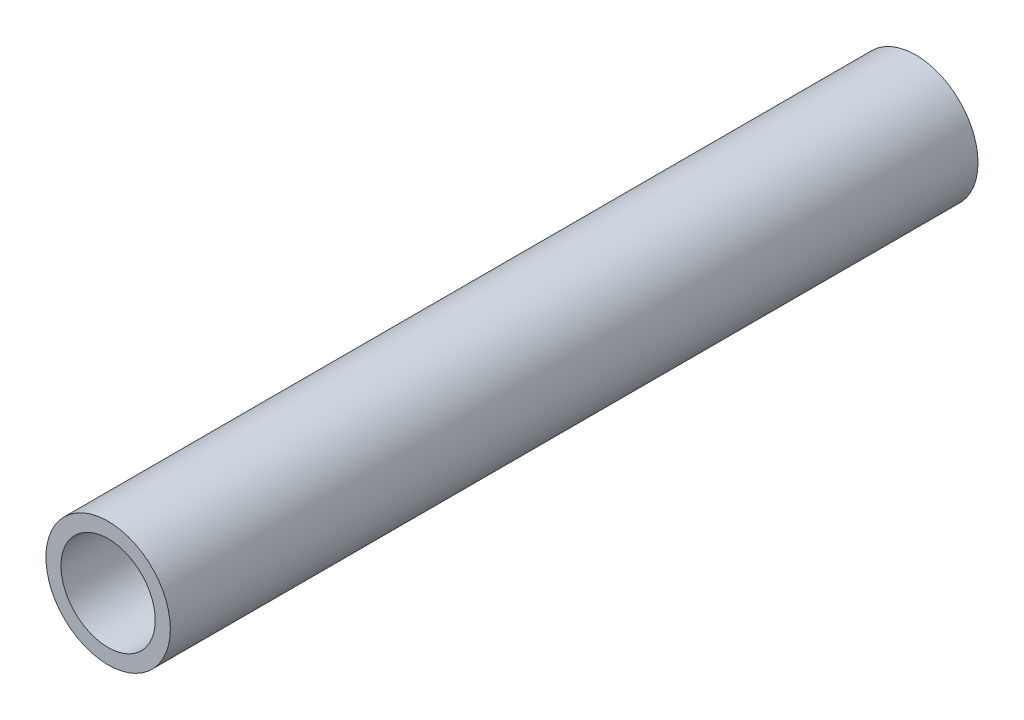
ISO-10303-21;
HEADER;
FILE_DESCRIPTION(('STEP AP214'),'2;1');
FILE_NAME('part.step','',(''),(''),'','','');
FILE_SCHEMA(('AUTOMOTIVE_DESIGN { 1 0 10303 214 1 1 1 1 }'));
ENDSEC;
DATA;
#1=APPLICATION_CONTEXT('core data for automotive mechanical design processes');
#2=APPLICATION_PROTOCOL_DEFINITION('international standard','automotive_design',2000,#1);
#3=PRODUCT_CONTEXT('',#1,'mechanical');
#4=PRODUCT('Part','Part','',(#3));
#5=PRODUCT_RELATED_PRODUCT_CATEGORY('part','',(#4));
#6=PRODUCT_DEFINITION_FORMATION('','',#4);
#7=PRODUCT_DEFINITION_CONTEXT('part definition',#1,'design');
#8=PRODUCT_DEFINITION('design','',#6,#7);
#9=PRODUCT_DEFINITION_SHAPE('','',#8);
#10=(LENGTH_UNIT() NAMED_UNIT(*) SI_UNIT(.MILLI.,.METRE.));
#11=(NAMED_UNIT(*) PLANE_ANGLE_UNIT() SI_UNIT($,.RADIAN.));
#12=(NAMED_UNIT(*) SI_UNIT($,.STERADIAN.) SOLID_ANGLE_UNIT());
#13=UNCERTAINTY_MEASURE_WITH_UNIT(LENGTH_MEASURE(1.E-05),#10,'distance_accuracy_value','');
#14=(GEOMETRIC_REPRESENTATION_CONTEXT(3) GLOBAL_UNCERTAINTY_ASSIGNED_CONTEXT((#13)) GLOBAL_UNIT_ASSIGNED_CONTEXT((#10,
#11,#12)) REPRESENTATION_CONTEXT('',''));
#15=CARTESIAN_POINT('',(0.,0.,0.));
#16=DIRECTION('',(0.,0.,1.));
#17=DIRECTION('',(1.,0.,0.));
#18=AXIS2_PLACEMENT_3D('',#15,#16,#17);
#19=CARTESIAN_POINT('',(0.,0.,95.2));
#20=DIRECTION('',(0.,0.,1.));
#21=DIRECTION('',(1.,0.,0.));
#22=AXIS2_PLACEMENT_3D('',#19,#20,#21);
#23=PLANE('',#22);
#24=CARTESIAN_POINT('',(0.,0.,95.2));
#25=DIRECTION('',(0.,0.,1.));
#26=DIRECTION('',(1.,0.,0.));
#27=AXIS2_PLACEMENT_3D('',#24,#25,#26);
#28=CIRCLE('',#27,14.6685);
#29=CARTESIAN_POINT('',(14.6685,0.,95.2));
#30=VERTEX_POINT('',#29);
#31=EDGE_CURVE('E10',#30,#30,#28,.T.);
#32=ORIENTED_EDGE('',*,*,#31,.T.);
#33=EDGE_LOOP('',(#32));
#34=FACE_BOUND('',#33,.T.);
#35=CARTESIAN_POINT('',(0.,0.,95.2));
#36=DIRECTION('',(0.,0.,1.));
#37=DIRECTION('',(1.,0.,0.));
#38=AXIS2_PLACEMENT_3D('',#35,#36,#37);
#39=CIRCLE('',#38,11.1125);
#40=CARTESIAN_POINT('',(11.1125,0.,95.2));
#41=VERTEX_POINT('',#40);
#42=EDGE_CURVE('E46',#41,#41,#39,.T.);
#43=ORIENTED_EDGE('',*,*,#42,.F.);
#44=EDGE_LOOP('',(#43));
#45=FACE_BOUND('',#44,.T.);
#46=ADVANCED_FACE('F35',(#34,#45),#23,.T.);
#47=CARTESIAN_POINT('',(0.,0.,-95.2));
#48=DIRECTION('',(0.,0.,1.));
#49=DIRECTION('',(1.,0.,0.));
#50=AXIS2_PLACEMENT_3D('',#47,#48,#49);
#51=PLANE('',#50);
#52=CARTESIAN_POINT('',(0.,0.,-95.2));
#53=DIRECTION('',(0.,0.,1.));
#54=DIRECTION('',(1.,0.,0.));
#55=AXIS2_PLACEMENT_3D('',#52,#53,#54);
#56=CIRCLE('',#55,14.6685);
#57=CARTESIAN_POINT('',(14.6685,0.,-95.2));
#58=VERTEX_POINT('',#57);
#59=EDGE_CURVE('E39',#58,#58,#56,.T.);
#60=ORIENTED_EDGE('',*,*,#59,.F.);
#61=EDGE_LOOP('',(#60));
#62=FACE_BOUND('',#61,.T.);
#63=CARTESIAN_POINT('',(0.,0.,-95.2));
#64=DIRECTION('',(0.,0.,1.));
#65=DIRECTION('',(1.,0.,0.));
#66=AXIS2_PLACEMENT_3D('',#63,#64,#65);
#67=CIRCLE('',#66,11.1125);
#68=CARTESIAN_POINT('',(11.1125,0.,-95.2));
#69=VERTEX_POINT('',#68);
#70=EDGE_CURVE('E48',#69,#69,#67,.T.);
#71=ORIENTED_EDGE('',*,*,#70,.T.);
#72=EDGE_LOOP('',(#71));
#73=FACE_BOUND('',#72,.T.);
#74=ADVANCED_FACE('F58',(#62,#73),#51,.F.);
#75=CARTESIAN_POINT('',(0.,0.,95.2));
#76=DIRECTION('',(0.,0.,-1.));
#77=DIRECTION('',(-1.,0.,0.));
#78=AXIS2_PLACEMENT_3D('',#75,#76,#77);
#79=CYLINDRICAL_SURFACE('',#78,14.6685);
#80=ORIENTED_EDGE('',*,*,#31,.F.);
#81=EDGE_LOOP('',(#80));
#82=FACE_BOUND('',#81,.T.);
#83=ORIENTED_EDGE('',*,*,#59,.T.);
#84=EDGE_LOOP('',(#83));
#85=FACE_BOUND('',#84,.T.);
#86=ADVANCED_FACE('F37',(#82,#85),#79,.T.);
#87=CARTESIAN_POINT('',(0.,0.,95.2));
#88=DIRECTION('',(0.,0.,-1.));
#89=DIRECTION('',(-1.,0.,0.));
#90=AXIS2_PLACEMENT_3D('',#87,#88,#89);
#91=CYLINDRICAL_SURFACE('',#90,11.1125);
#92=ORIENTED_EDGE('',*,*,#42,.T.);
#93=EDGE_LOOP('',(#92));
#94=FACE_BOUND('',#93,.T.);
#95=ORIENTED_EDGE('',*,*,#70,.F.);
#96=EDGE_LOOP('',(#95));
#97=FACE_BOUND('',#96,.T.);
#98=ADVANCED_FACE('F54',(#94,#97),#91,.F.);
#99=CLOSED_SHELL('',(#46,#74,#86,#98));
#100=MANIFOLD_SOLID_BREP('B2',#99);
#101=ADVANCED_BREP_SHAPE_REPRESENTATION('',(#18,#100),#14);
#102=SHAPE_DEFINITION_REPRESENTATION(#9,#101);
ENDSEC;
END-ISO-10303-21;
